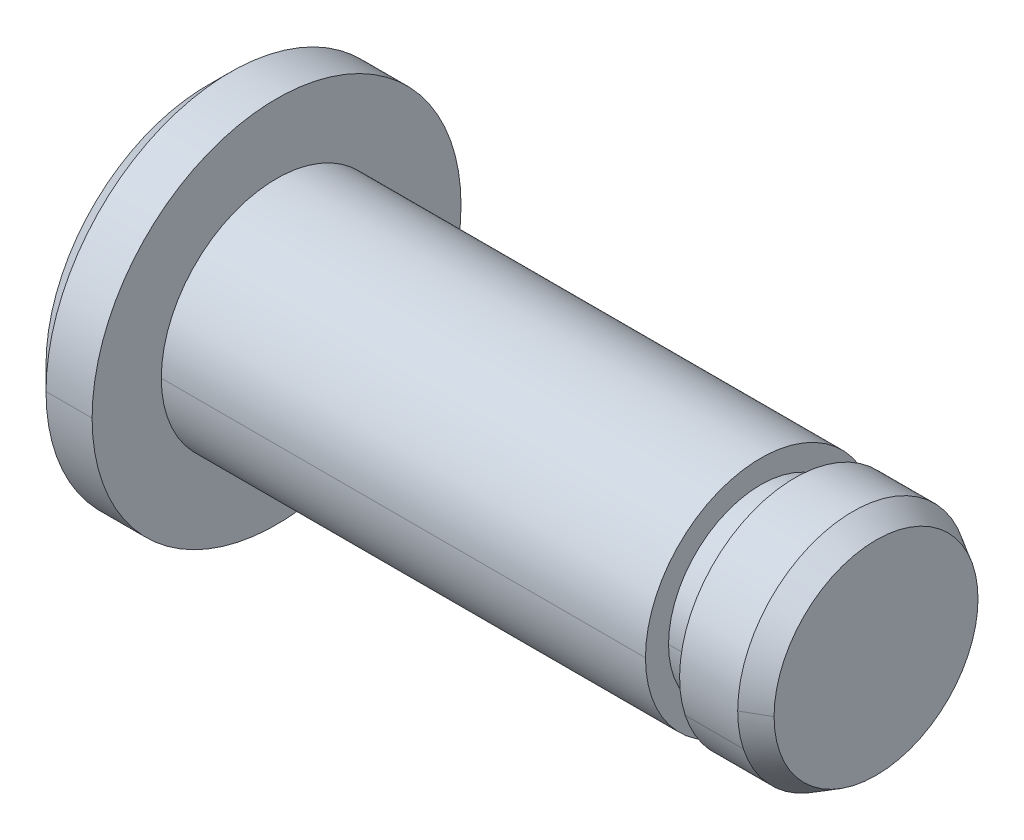
ISO-10303-21;
HEADER;
FILE_DESCRIPTION(('STEP AP214'),'2;1');
FILE_NAME('part.step','',(''),(''),'','','');
FILE_SCHEMA(('AUTOMOTIVE_DESIGN { 1 0 10303 214 1 1 1 1 }'));
ENDSEC;
DATA;
#1=APPLICATION_CONTEXT('core data for automotive mechanical design processes');
#2=APPLICATION_PROTOCOL_DEFINITION('international standard','automotive_design',2000,#1);
#3=PRODUCT_CONTEXT('',#1,'mechanical');
#4=PRODUCT('Part','Part','',(#3));
#5=PRODUCT_RELATED_PRODUCT_CATEGORY('part','',(#4));
#6=PRODUCT_DEFINITION_FORMATION('','',#4);
#7=PRODUCT_DEFINITION_CONTEXT('part definition',#1,'design');
#8=PRODUCT_DEFINITION('design','',#6,#7);
#9=PRODUCT_DEFINITION_SHAPE('','',#8);
#10=(LENGTH_UNIT() NAMED_UNIT(*) SI_UNIT(.MILLI.,.METRE.));
#11=(NAMED_UNIT(*) PLANE_ANGLE_UNIT() SI_UNIT($,.RADIAN.));
#12=(NAMED_UNIT(*) SI_UNIT($,.STERADIAN.) SOLID_ANGLE_UNIT());
#13=UNCERTAINTY_MEASURE_WITH_UNIT(LENGTH_MEASURE(1.E-05),#10,'distance_accuracy_value','');
#14=(GEOMETRIC_REPRESENTATION_CONTEXT(3) GLOBAL_UNCERTAINTY_ASSIGNED_CONTEXT((#13)) GLOBAL_UNIT_ASSIGNED_CONTEXT((#10,
#11,#12)) REPRESENTATION_CONTEXT('',''));
#15=CARTESIAN_POINT('',(0.,0.,0.));
#16=DIRECTION('',(0.,0.,1.));
#17=DIRECTION('',(1.,0.,0.));
#18=AXIS2_PLACEMENT_3D('',#15,#16,#17);
#19=CARTESIAN_POINT('',(-1.5,0.,0.));
#20=DIRECTION('',(1.,0.,0.));
#21=DIRECTION('',(0.,0.,-1.));
#22=AXIS2_PLACEMENT_3D('',#19,#20,#21);
#23=PLANE('',#22);
#24=CARTESIAN_POINT('',(-1.5,0.,0.));
#25=DIRECTION('',(1.,0.,0.));
#26=DIRECTION('',(0.,0.,-1.));
#27=AXIS2_PLACEMENT_3D('',#24,#25,#26);
#28=CIRCLE('',#27,3.5);
#29=CARTESIAN_POINT('',(-1.5,0.,3.5));
#30=VERTEX_POINT('',#29);
#31=CARTESIAN_POINT('',(-1.5,0.,-3.5));
#32=VERTEX_POINT('',#31);
#33=EDGE_CURVE('E11',#30,#32,#28,.T.);
#34=ORIENTED_EDGE('',*,*,#33,.F.);
#35=CARTESIAN_POINT('',(-1.5,0.,0.));
#36=DIRECTION('',(1.,0.,0.));
#37=DIRECTION('',(0.,0.,-1.));
#38=AXIS2_PLACEMENT_3D('',#35,#36,#37);
#39=CIRCLE('',#38,3.5);
#40=EDGE_CURVE('E24',#32,#30,#39,.T.);
#41=ORIENTED_EDGE('',*,*,#40,.F.);
#42=EDGE_LOOP('',(#34,#41));
#43=FACE_BOUND('',#42,.T.);
#44=ADVANCED_FACE('F16',(#43),#23,.F.);
#45=CARTESIAN_POINT('',(-1.5,0.,0.));
#46=DIRECTION('',(1.,0.,0.));
#47=DIRECTION('',(0.,-1.,0.));
#48=AXIS2_PLACEMENT_3D('',#45,#46,#47);
#49=CONICAL_SURFACE('',#48,3.5,0.78539816339745);
#50=DIRECTION('',(0.707106781186546,0.,0.707106781186549));
#51=VECTOR('',#50,1.);
#52=CARTESIAN_POINT('',(-1.5,0.,3.5));
#53=LINE('',#52,#51);
#54=CARTESIAN_POINT('',(-1.,0.,4.));
#55=VERTEX_POINT('',#54);
#56=EDGE_CURVE('E242',#30,#55,#53,.T.);
#57=ORIENTED_EDGE('',*,*,#56,.T.);
#58=CARTESIAN_POINT('',(-1.,0.,0.));
#59=DIRECTION('',(1.,0.,0.));
#60=DIRECTION('',(0.,0.,-1.));
#61=AXIS2_PLACEMENT_3D('',#58,#59,#60);
#62=CIRCLE('',#61,4.);
#63=CARTESIAN_POINT('',(-1.,0.,-4.));
#64=VERTEX_POINT('',#63);
#65=EDGE_CURVE('E237',#64,#55,#62,.T.);
#66=ORIENTED_EDGE('',*,*,#65,.F.);
#67=DIRECTION('',(0.707106781186547,0.,-0.707106781186548));
#68=VECTOR('',#67,1.);
#69=CARTESIAN_POINT('',(-1.5,0.,-3.5));
#70=LINE('',#69,#68);
#71=EDGE_CURVE('E232',#32,#64,#70,.T.);
#72=ORIENTED_EDGE('',*,*,#71,.F.);
#73=ORIENTED_EDGE('',*,*,#40,.T.);
#74=EDGE_LOOP('',(#57,#66,#72,#73));
#75=FACE_BOUND('',#74,.T.);
#76=ADVANCED_FACE('F251',(#75),#49,.T.);
#77=CARTESIAN_POINT('',(-1.5,0.,0.));
#78=DIRECTION('',(1.,0.,0.));
#79=DIRECTION('',(0.,1.,0.));
#80=AXIS2_PLACEMENT_3D('',#77,#78,#79);
#81=CONICAL_SURFACE('',#80,3.5,0.78539816339745);
#82=ORIENTED_EDGE('',*,*,#56,.F.);
#83=ORIENTED_EDGE('',*,*,#33,.T.);
#84=ORIENTED_EDGE('',*,*,#71,.T.);
#85=CARTESIAN_POINT('',(-1.,0.,0.));
#86=DIRECTION('',(1.,0.,0.));
#87=DIRECTION('',(0.,0.,-1.));
#88=AXIS2_PLACEMENT_3D('',#85,#86,#87);
#89=CIRCLE('',#88,4.);
#90=EDGE_CURVE('E227',#55,#64,#89,.T.);
#91=ORIENTED_EDGE('',*,*,#90,.F.);
#92=EDGE_LOOP('',(#82,#83,#84,#91));
#93=FACE_BOUND('',#92,.T.);
#94=ADVANCED_FACE('F254',(#93),#81,.T.);
#95=CARTESIAN_POINT('',(13.,0.,0.));
#96=DIRECTION('',(1.,0.,0.));
#97=DIRECTION('',(0.,1.,0.));
#98=AXIS2_PLACEMENT_3D('',#95,#96,#97);
#99=CYLINDRICAL_SURFACE('',#98,4.);
#100=DIRECTION('',(1.,0.,0.));
#101=VECTOR('',#100,1.);
#102=CARTESIAN_POINT('',(-1.,0.,4.));
#103=LINE('',#102,#101);
#104=CARTESIAN_POINT('',(0.,0.,4.));
#105=VERTEX_POINT('',#104);
#106=EDGE_CURVE('E222',#55,#105,#103,.T.);
#107=ORIENTED_EDGE('',*,*,#106,.F.);
#108=ORIENTED_EDGE('',*,*,#90,.T.);
#109=DIRECTION('',(1.,0.,0.));
#110=VECTOR('',#109,1.);
#111=CARTESIAN_POINT('',(-1.,0.,-4.));
#112=LINE('',#111,#110);
#113=CARTESIAN_POINT('',(0.,0.,-4.));
#114=VERTEX_POINT('',#113);
#115=EDGE_CURVE('E218',#64,#114,#112,.T.);
#116=ORIENTED_EDGE('',*,*,#115,.T.);
#117=CARTESIAN_POINT('',(0.,0.,0.));
#118=DIRECTION('',(1.,0.,0.));
#119=DIRECTION('',(0.,0.,-1.));
#120=AXIS2_PLACEMENT_3D('',#117,#118,#119);
#121=CIRCLE('',#120,4.);
#122=EDGE_CURVE('E213',#105,#114,#121,.T.);
#123=ORIENTED_EDGE('',*,*,#122,.F.);
#124=EDGE_LOOP('',(#107,#108,#116,#123));
#125=FACE_BOUND('',#124,.T.);
#126=ADVANCED_FACE('F258',(#125),#99,.T.);
#127=CARTESIAN_POINT('',(0.,4.,0.));
#128=DIRECTION('',(-1.,0.,0.));
#129=DIRECTION('',(0.,0.,1.));
#130=AXIS2_PLACEMENT_3D('',#127,#128,#129);
#131=PLANE('',#130);
#132=CARTESIAN_POINT('',(0.,0.,0.));
#133=DIRECTION('',(1.,0.,0.));
#134=DIRECTION('',(0.,0.,-1.));
#135=AXIS2_PLACEMENT_3D('',#132,#133,#134);
#136=CIRCLE('',#135,2.5);
#137=CARTESIAN_POINT('',(0.,0.,2.5));
#138=VERTEX_POINT('',#137);
#139=CARTESIAN_POINT('',(0.,0.,-2.5));
#140=VERTEX_POINT('',#139);
#141=EDGE_CURVE('E208',#138,#140,#136,.T.);
#142=ORIENTED_EDGE('',*,*,#141,.F.);
#143=CARTESIAN_POINT('',(0.,0.,0.));
#144=DIRECTION('',(1.,0.,0.));
#145=DIRECTION('',(0.,0.,-1.));
#146=AXIS2_PLACEMENT_3D('',#143,#144,#145);
#147=CIRCLE('',#146,2.5);
#148=EDGE_CURVE('E203',#140,#138,#147,.T.);
#149=ORIENTED_EDGE('',*,*,#148,.F.);
#150=EDGE_LOOP('',(#142,#149));
#151=FACE_BOUND('',#150,.T.);
#152=CARTESIAN_POINT('',(0.,0.,0.));
#153=DIRECTION('',(1.,0.,0.));
#154=DIRECTION('',(0.,0.,-1.));
#155=AXIS2_PLACEMENT_3D('',#152,#153,#154);
#156=CIRCLE('',#155,4.);
#157=EDGE_CURVE('E198',#114,#105,#156,.T.);
#158=ORIENTED_EDGE('',*,*,#157,.T.);
#159=ORIENTED_EDGE('',*,*,#122,.T.);
#160=EDGE_LOOP('',(#158,#159));
#161=FACE_BOUND('',#160,.T.);
#162=ADVANCED_FACE('F263',(#151,#161),#131,.F.);
#163=CARTESIAN_POINT('',(13.,0.,0.));
#164=DIRECTION('',(1.,0.,0.));
#165=DIRECTION('',(0.,-1.,-5.8935951136395E-10));
#166=AXIS2_PLACEMENT_3D('',#163,#164,#165);
#167=CYLINDRICAL_SURFACE('',#166,4.);
#168=ORIENTED_EDGE('',*,*,#106,.T.);
#169=ORIENTED_EDGE('',*,*,#157,.F.);
#170=ORIENTED_EDGE('',*,*,#115,.F.);
#171=ORIENTED_EDGE('',*,*,#65,.T.);
#172=EDGE_LOOP('',(#168,#169,#170,#171));
#173=FACE_BOUND('',#172,.T.);
#174=ADVANCED_FACE('F261',(#173),#167,.T.);
#175=CARTESIAN_POINT('',(13.,0.,0.));
#176=DIRECTION('',(1.,0.,0.));
#177=DIRECTION('',(0.,-1.,0.));
#178=AXIS2_PLACEMENT_3D('',#175,#176,#177);
#179=CYLINDRICAL_SURFACE('',#178,2.5);
#180=DIRECTION('',(1.,0.,0.));
#181=VECTOR('',#180,1.);
#182=CARTESIAN_POINT('',(0.,0.,2.5));
#183=LINE('',#182,#181);
#184=CARTESIAN_POINT('',(10.5,0.,2.5));
#185=VERTEX_POINT('',#184);
#186=EDGE_CURVE('E194',#138,#185,#183,.T.);
#187=ORIENTED_EDGE('',*,*,#186,.T.);
#188=CARTESIAN_POINT('',(10.5,0.,0.));
#189=DIRECTION('',(1.,0.,0.));
#190=DIRECTION('',(0.,0.,-1.));
#191=AXIS2_PLACEMENT_3D('',#188,#189,#190);
#192=CIRCLE('',#191,2.5);
#193=CARTESIAN_POINT('',(10.5,0.,-2.5));
#194=VERTEX_POINT('',#193);
#195=EDGE_CURVE('E189',#194,#185,#192,.T.);
#196=ORIENTED_EDGE('',*,*,#195,.F.);
#197=DIRECTION('',(1.,0.,0.));
#198=VECTOR('',#197,1.);
#199=CARTESIAN_POINT('',(0.,0.,-2.5));
#200=LINE('',#199,#198);
#201=EDGE_CURVE('E184',#140,#194,#200,.T.);
#202=ORIENTED_EDGE('',*,*,#201,.F.);
#203=ORIENTED_EDGE('',*,*,#148,.T.);
#204=EDGE_LOOP('',(#187,#196,#202,#203));
#205=FACE_BOUND('',#204,.T.);
#206=ADVANCED_FACE('F272',(#205),#179,.T.);
#207=CARTESIAN_POINT('',(13.,0.,0.));
#208=DIRECTION('',(1.,0.,0.));
#209=DIRECTION('',(0.,1.,0.));
#210=AXIS2_PLACEMENT_3D('',#207,#208,#209);
#211=CYLINDRICAL_SURFACE('',#210,2.5);
#212=ORIENTED_EDGE('',*,*,#186,.F.);
#213=ORIENTED_EDGE('',*,*,#141,.T.);
#214=ORIENTED_EDGE('',*,*,#201,.T.);
#215=CARTESIAN_POINT('',(10.5,0.,0.));
#216=DIRECTION('',(1.,0.,0.));
#217=DIRECTION('',(0.,0.,-1.));
#218=AXIS2_PLACEMENT_3D('',#215,#216,#217);
#219=CIRCLE('',#218,2.5);
#220=EDGE_CURVE('E179',#185,#194,#219,.T.);
#221=ORIENTED_EDGE('',*,*,#220,.F.);
#222=EDGE_LOOP('',(#212,#213,#214,#221));
#223=FACE_BOUND('',#222,.T.);
#224=ADVANCED_FACE('F317',(#223),#211,.T.);
#225=CARTESIAN_POINT('',(10.5,2.5,0.));
#226=DIRECTION('',(-1.,0.,0.));
#227=DIRECTION('',(0.,0.,1.));
#228=AXIS2_PLACEMENT_3D('',#225,#226,#227);
#229=PLANE('',#228);
#230=CARTESIAN_POINT('',(10.5,0.,0.));
#231=DIRECTION('',(1.,0.,0.));
#232=DIRECTION('',(0.,0.,-1.));
#233=AXIS2_PLACEMENT_3D('',#230,#231,#232);
#234=CIRCLE('',#233,2.);
#235=CARTESIAN_POINT('',(10.5,0.,2.));
#236=VERTEX_POINT('',#235);
#237=CARTESIAN_POINT('',(10.5,0.,-2.));
#238=VERTEX_POINT('',#237);
#239=EDGE_CURVE('E174',#236,#238,#234,.T.);
#240=ORIENTED_EDGE('',*,*,#239,.F.);
#241=CARTESIAN_POINT('',(10.5,0.,0.));
#242=DIRECTION('',(1.,0.,0.));
#243=DIRECTION('',(0.,0.,-1.));
#244=AXIS2_PLACEMENT_3D('',#241,#242,#243);
#245=CIRCLE('',#244,2.);
#246=EDGE_CURVE('E169',#238,#236,#245,.T.);
#247=ORIENTED_EDGE('',*,*,#246,.F.);
#248=EDGE_LOOP('',(#240,#247));
#249=FACE_BOUND('',#248,.T.);
#250=ORIENTED_EDGE('',*,*,#195,.T.);
#251=ORIENTED_EDGE('',*,*,#220,.T.);
#252=EDGE_LOOP('',(#250,#251));
#253=FACE_BOUND('',#252,.T.);
#254=ADVANCED_FACE('F328',(#249,#253),#229,.F.);
#255=CARTESIAN_POINT('',(13.,0.,0.));
#256=DIRECTION('',(1.,0.,0.));
#257=DIRECTION('',(0.,-1.,0.));
#258=AXIS2_PLACEMENT_3D('',#255,#256,#257);
#259=CYLINDRICAL_SURFACE('',#258,2.);
#260=DIRECTION('',(1.,0.,0.));
#261=VECTOR('',#260,1.);
#262=CARTESIAN_POINT('',(10.5,0.,2.));
#263=LINE('',#262,#261);
#264=CARTESIAN_POINT('',(11.24,0.,2.));
#265=VERTEX_POINT('',#264);
#266=EDGE_CURVE('E165',#236,#265,#263,.T.);
#267=ORIENTED_EDGE('',*,*,#266,.T.);
#268=CARTESIAN_POINT('',(11.24,0.,0.));
#269=DIRECTION('',(1.,0.,0.));
#270=DIRECTION('',(0.,0.,-1.));
#271=AXIS2_PLACEMENT_3D('',#268,#269,#270);
#272=CIRCLE('',#271,2.);
#273=CARTESIAN_POINT('',(11.24,0.,-2.));
#274=VERTEX_POINT('',#273);
#275=EDGE_CURVE('E160',#274,#265,#272,.T.);
#276=ORIENTED_EDGE('',*,*,#275,.F.);
#277=DIRECTION('',(1.,0.,0.));
#278=VECTOR('',#277,1.);
#279=CARTESIAN_POINT('',(10.5,0.,-2.));
#280=LINE('',#279,#278);
#281=EDGE_CURVE('E155',#238,#274,#280,.T.);
#282=ORIENTED_EDGE('',*,*,#281,.F.);
#283=ORIENTED_EDGE('',*,*,#246,.T.);
#284=EDGE_LOOP('',(#267,#276,#282,#283));
#285=FACE_BOUND('',#284,.T.);
#286=ADVANCED_FACE('F339',(#285),#259,.T.);
#287=CARTESIAN_POINT('',(13.,0.,0.));
#288=DIRECTION('',(1.,0.,0.));
#289=DIRECTION('',(0.,1.,0.));
#290=AXIS2_PLACEMENT_3D('',#287,#288,#289);
#291=CYLINDRICAL_SURFACE('',#290,2.);
#292=ORIENTED_EDGE('',*,*,#266,.F.);
#293=ORIENTED_EDGE('',*,*,#239,.T.);
#294=ORIENTED_EDGE('',*,*,#281,.T.);
#295=CARTESIAN_POINT('',(11.24,0.,0.));
#296=DIRECTION('',(1.,0.,0.));
#297=DIRECTION('',(0.,0.,-1.));
#298=AXIS2_PLACEMENT_3D('',#295,#296,#297);
#299=CIRCLE('',#298,2.);
#300=EDGE_CURVE('E150',#265,#274,#299,.T.);
#301=ORIENTED_EDGE('',*,*,#300,.F.);
#302=EDGE_LOOP('',(#292,#293,#294,#301));
#303=FACE_BOUND('',#302,.T.);
#304=ADVANCED_FACE('F350',(#303),#291,.T.);
#305=CARTESIAN_POINT('',(11.24,2.,0.));
#306=DIRECTION('',(1.,0.,0.));
#307=DIRECTION('',(0.,0.,-1.));
#308=AXIS2_PLACEMENT_3D('',#305,#306,#307);
#309=PLANE('',#308);
#310=CARTESIAN_POINT('',(11.24,0.,0.));
#311=DIRECTION('',(1.,0.,0.));
#312=DIRECTION('',(0.,0.,-1.));
#313=AXIS2_PLACEMENT_3D('',#310,#311,#312);
#314=CIRCLE('',#313,2.5);
#315=CARTESIAN_POINT('',(11.24,-0.772542485937367,2.37764129073788));
#316=VERTEX_POINT('',#315);
#317=CARTESIAN_POINT('',(11.24,0.,-2.5));
#318=VERTEX_POINT('',#317);
#319=EDGE_CURVE('E145',#316,#318,#314,.T.);
#320=ORIENTED_EDGE('',*,*,#319,.F.);
#321=CARTESIAN_POINT('',(11.24,0.,0.));
#322=DIRECTION('',(1.,0.,0.));
#323=DIRECTION('',(0.,0.,-1.));
#324=AXIS2_PLACEMENT_3D('',#321,#322,#323);
#325=CIRCLE('',#324,2.5);
#326=EDGE_CURVE('E140',#318,#316,#325,.T.);
#327=ORIENTED_EDGE('',*,*,#326,.F.);
#328=EDGE_LOOP('',(#320,#327));
#329=FACE_BOUND('',#328,.T.);
#330=ORIENTED_EDGE('',*,*,#275,.T.);
#331=ORIENTED_EDGE('',*,*,#300,.T.);
#332=EDGE_LOOP('',(#330,#331));
#333=FACE_BOUND('',#332,.T.);
#334=ADVANCED_FACE('F361',(#329,#333),#309,.F.);
#335=CARTESIAN_POINT('',(13.,0.,0.));
#336=DIRECTION('',(1.,0.,0.));
#337=DIRECTION('',(0.,-0.987688340595138,-0.156434465040231));
#338=AXIS2_PLACEMENT_3D('',#335,#336,#337);
#339=CYLINDRICAL_SURFACE('',#338,2.5);
#340=DIRECTION('',(1.,0.,0.));
#341=VECTOR('',#340,1.);
#342=CARTESIAN_POINT('',(11.24,-0.772542485937367,2.37764129073788));
#343=LINE('',#342,#341);
#344=CARTESIAN_POINT('',(12.5,-0.772542485937367,2.37764129073788));
#345=VERTEX_POINT('',#344);
#346=EDGE_CURVE('E136',#316,#345,#343,.T.);
#347=ORIENTED_EDGE('',*,*,#346,.T.);
#348=CARTESIAN_POINT('',(12.5,0.,0.));
#349=DIRECTION('',(1.,0.,0.));
#350=DIRECTION('',(0.,0.,-1.));
#351=AXIS2_PLACEMENT_3D('',#348,#349,#350);
#352=CIRCLE('',#351,2.5);
#353=CARTESIAN_POINT('',(12.5,0.,2.5));
#354=VERTEX_POINT('',#353);
#355=EDGE_CURVE('E132',#354,#345,#352,.T.);
#356=ORIENTED_EDGE('',*,*,#355,.F.);
#357=CARTESIAN_POINT('',(12.5,0.,0.));
#358=DIRECTION('',(1.,0.,0.));
#359=DIRECTION('',(0.,0.,-1.));
#360=AXIS2_PLACEMENT_3D('',#357,#358,#359);
#361=CIRCLE('',#360,2.5);
#362=CARTESIAN_POINT('',(12.5,0.,-2.5));
#363=VERTEX_POINT('',#362);
#364=EDGE_CURVE('E108',#363,#354,#361,.T.);
#365=ORIENTED_EDGE('',*,*,#364,.F.);
#366=DIRECTION('',(1.,0.,0.));
#367=VECTOR('',#366,1.);
#368=CARTESIAN_POINT('',(11.24,0.,-2.5));
#369=LINE('',#368,#367);
#370=EDGE_CURVE('E124',#318,#363,#369,.T.);
#371=ORIENTED_EDGE('',*,*,#370,.F.);
#372=ORIENTED_EDGE('',*,*,#326,.T.);
#373=EDGE_LOOP('',(#347,#356,#365,#371,#372));
#374=FACE_BOUND('',#373,.T.);
#375=ADVANCED_FACE('F372',(#374),#339,.T.);
#376=CARTESIAN_POINT('',(13.,0.,0.));
#377=DIRECTION('',(1.,0.,0.));
#378=DIRECTION('',(0.,0.987688340595138,0.156434465040231));
#379=AXIS2_PLACEMENT_3D('',#376,#377,#378);
#380=CYLINDRICAL_SURFACE('',#379,2.5);
#381=ORIENTED_EDGE('',*,*,#346,.F.);
#382=ORIENTED_EDGE('',*,*,#319,.T.);
#383=ORIENTED_EDGE('',*,*,#370,.T.);
#384=CARTESIAN_POINT('',(12.5,0.,0.));
#385=DIRECTION('',(1.,0.,0.));
#386=DIRECTION('',(0.,0.,-1.));
#387=AXIS2_PLACEMENT_3D('',#384,#385,#386);
#388=CIRCLE('',#387,2.5);
#389=EDGE_CURVE('E120',#345,#363,#388,.T.);
#390=ORIENTED_EDGE('',*,*,#389,.F.);
#391=EDGE_LOOP('',(#381,#382,#383,#390));
#392=FACE_BOUND('',#391,.T.);
#393=ADVANCED_FACE('F383',(#392),#380,.T.);
#394=CARTESIAN_POINT('',(12.5,0.,0.));
#395=DIRECTION('',(-1.,0.,0.));
#396=DIRECTION('',(0.,1.,0.));
#397=AXIS2_PLACEMENT_3D('',#394,#395,#396);
#398=CONICAL_SURFACE('',#397,2.5,0.523598775598279);
#399=DIRECTION('',(-0.866025403784448,0.,-0.499999999999983));
#400=VECTOR('',#399,1.);
#401=CARTESIAN_POINT('',(13.,0.,-2.2113248654052));
#402=LINE('',#401,#400);
#403=CARTESIAN_POINT('',(13.,0.,-2.2113248654052));
#404=VERTEX_POINT('',#403);
#405=EDGE_CURVE('E100',#404,#363,#402,.T.);
#406=ORIENTED_EDGE('',*,*,#405,.F.);
#407=CARTESIAN_POINT('',(13.,0.,0.));
#408=DIRECTION('',(1.,0.,0.));
#409=DIRECTION('',(0.,0.,-1.));
#410=AXIS2_PLACEMENT_3D('',#407,#408,#409);
#411=CIRCLE('',#410,2.2113248654052);
#412=CARTESIAN_POINT('',(13.,0.,2.2113248654052));
#413=VERTEX_POINT('',#412);
#414=EDGE_CURVE('E92',#413,#404,#411,.T.);
#415=ORIENTED_EDGE('',*,*,#414,.F.);
#416=DIRECTION('',(-0.866025403784448,0.,0.499999999999983));
#417=VECTOR('',#416,1.);
#418=CARTESIAN_POINT('',(13.,0.,2.2113248654052));
#419=LINE('',#418,#417);
#420=EDGE_CURVE('E96',#413,#354,#419,.T.);
#421=ORIENTED_EDGE('',*,*,#420,.T.);
#422=ORIENTED_EDGE('',*,*,#355,.T.);
#423=ORIENTED_EDGE('',*,*,#389,.T.);
#424=EDGE_LOOP('',(#406,#415,#421,#422,#423));
#425=FACE_BOUND('',#424,.T.);
#426=ADVANCED_FACE('F94',(#425),#398,.T.);
#427=CARTESIAN_POINT('',(12.5,0.,0.));
#428=DIRECTION('',(-1.,0.,0.));
#429=DIRECTION('',(0.,-1.,0.));
#430=AXIS2_PLACEMENT_3D('',#427,#428,#429);
#431=CONICAL_SURFACE('',#430,2.5,0.523598775598279);
#432=ORIENTED_EDGE('',*,*,#405,.T.);
#433=ORIENTED_EDGE('',*,*,#364,.T.);
#434=ORIENTED_EDGE('',*,*,#420,.F.);
#435=CARTESIAN_POINT('',(13.,0.,0.));
#436=DIRECTION('',(1.,0.,0.));
#437=DIRECTION('',(0.,0.,-1.));
#438=AXIS2_PLACEMENT_3D('',#435,#436,#437);
#439=CIRCLE('',#438,2.2113248654052);
#440=EDGE_CURVE('E107',#404,#413,#439,.T.);
#441=ORIENTED_EDGE('',*,*,#440,.F.);
#442=EDGE_LOOP('',(#432,#433,#434,#441));
#443=FACE_BOUND('',#442,.T.);
#444=ADVANCED_FACE('F106',(#443),#431,.T.);
#445=CARTESIAN_POINT('',(13.,2.2113248654052,0.));
#446=DIRECTION('',(-1.,0.,0.));
#447=DIRECTION('',(0.,0.,1.));
#448=AXIS2_PLACEMENT_3D('',#445,#446,#447);
#449=PLANE('',#448);
#450=ORIENTED_EDGE('',*,*,#440,.T.);
#451=ORIENTED_EDGE('',*,*,#414,.T.);
#452=EDGE_LOOP('',(#450,#451));
#453=FACE_BOUND('',#452,.T.);
#454=ADVANCED_FACE('F110',(#453),#449,.F.);
#455=CLOSED_SHELL('',(#44,#76,#94,#126,#162,#174,#206,#224,#254,#286,#304,#334,#375,#393,#426,
#444,#454));
#456=MANIFOLD_SOLID_BREP('B1',#455);
#457=ADVANCED_BREP_SHAPE_REPRESENTATION('',(#18,#456),#14);
#458=SHAPE_DEFINITION_REPRESENTATION(#9,#457);
ENDSEC;
END-ISO-10303-21;
